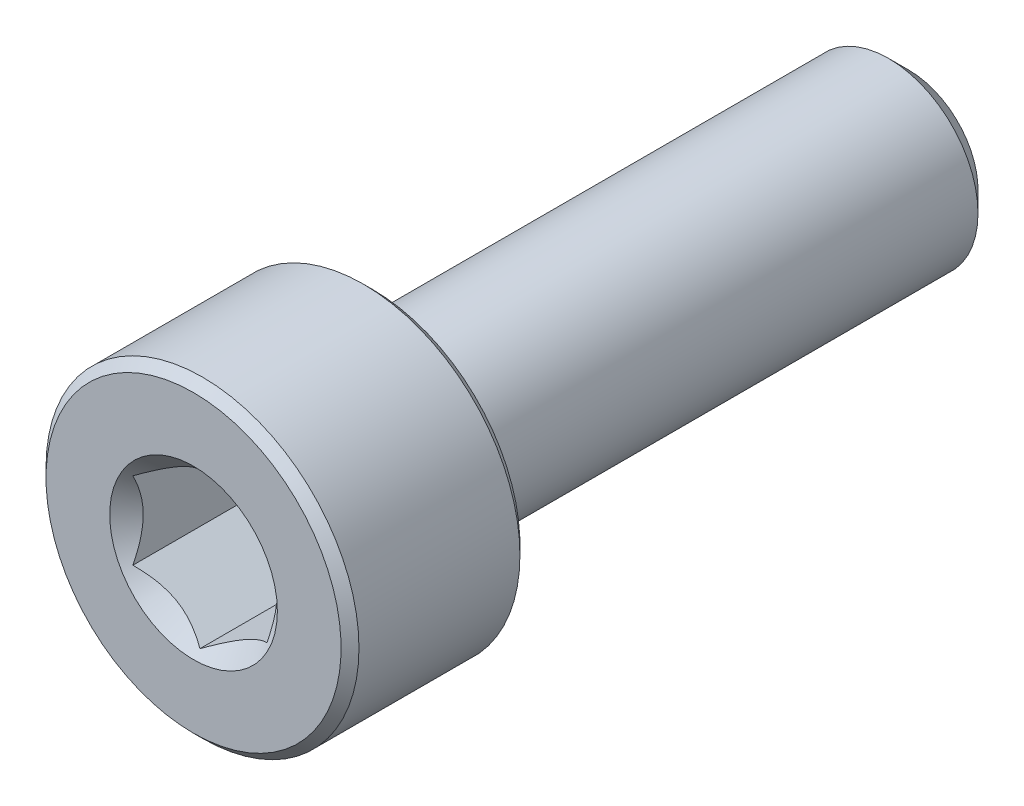
ISO-10303-21;
HEADER;
FILE_DESCRIPTION(('STEP AP214'),'2;1');
FILE_NAME('part.step','',(''),(''),'','','');
FILE_SCHEMA(('AUTOMOTIVE_DESIGN { 1 0 10303 214 1 1 1 1 }'));
ENDSEC;
DATA;
#1=APPLICATION_CONTEXT('core data for automotive mechanical design processes');
#2=APPLICATION_PROTOCOL_DEFINITION('international standard','automotive_design',2000,#1);
#3=PRODUCT_CONTEXT('',#1,'mechanical');
#4=PRODUCT('Part','Part','',(#3));
#5=PRODUCT_RELATED_PRODUCT_CATEGORY('part','',(#4));
#6=PRODUCT_DEFINITION_FORMATION('','',#4);
#7=PRODUCT_DEFINITION_CONTEXT('part definition',#1,'design');
#8=PRODUCT_DEFINITION('design','',#6,#7);
#9=PRODUCT_DEFINITION_SHAPE('','',#8);
#10=(LENGTH_UNIT() NAMED_UNIT(*) SI_UNIT(.MILLI.,.METRE.));
#11=(NAMED_UNIT(*) PLANE_ANGLE_UNIT() SI_UNIT($,.RADIAN.));
#12=(NAMED_UNIT(*) SI_UNIT($,.STERADIAN.) SOLID_ANGLE_UNIT());
#13=UNCERTAINTY_MEASURE_WITH_UNIT(LENGTH_MEASURE(1.E-05),#10,'distance_accuracy_value','');
#14=(GEOMETRIC_REPRESENTATION_CONTEXT(3) GLOBAL_UNCERTAINTY_ASSIGNED_CONTEXT((#13)) GLOBAL_UNIT_ASSIGNED_CONTEXT((#10,
#11,#12)) REPRESENTATION_CONTEXT('',''));
#15=CARTESIAN_POINT('',(0.,0.,0.));
#16=DIRECTION('',(0.,0.,1.));
#17=DIRECTION('',(1.,0.,0.));
#18=AXIS2_PLACEMENT_3D('',#15,#16,#17);
#19=CARTESIAN_POINT('',(0.,1.54533666301317,-8.));
#20=DIRECTION('',(0.,0.,-1.));
#21=DIRECTION('',(0.,1.,0.));
#22=AXIS2_PLACEMENT_3D('',#19,#20,#21);
#23=PLANE('',#22);
#24=CARTESIAN_POINT('',(0.,0.,-8.));
#25=DIRECTION('',(0.,0.,-1.));
#26=DIRECTION('',(0.,1.,0.));
#27=AXIS2_PLACEMENT_3D('',#24,#25,#26);
#28=CIRCLE('',#27,1.54533666301317);
#29=CARTESIAN_POINT('',(0.,1.54533666301317,-8.));
#30=VERTEX_POINT('',#29);
#31=EDGE_CURVE('E54',#30,#30,#28,.T.);
#32=ORIENTED_EDGE('',*,*,#31,.T.);
#33=EDGE_LOOP('',(#32));
#34=FACE_BOUND('',#33,.T.);
#35=ADVANCED_FACE('F41',(#34),#23,.T.);
#36=CARTESIAN_POINT('',(0.,0.,-8.));
#37=DIRECTION('',(0.,0.,1.));
#38=DIRECTION('',(0.,-1.,0.));
#39=AXIS2_PLACEMENT_3D('',#36,#37,#38);
#40=CONICAL_SURFACE('',#39,1.54533666301317,0.785398163397447);
#41=CARTESIAN_POINT('',(0.,0.,-7.54533666301317));
#42=DIRECTION('',(0.,0.,-1.));
#43=DIRECTION('',(0.,1.,0.));
#44=AXIS2_PLACEMENT_3D('',#41,#42,#43);
#45=CIRCLE('',#44,2.);
#46=CARTESIAN_POINT('',(0.,2.,-7.54533666301317));
#47=VERTEX_POINT('',#46);
#48=EDGE_CURVE('E157',#47,#47,#45,.T.);
#49=ORIENTED_EDGE('',*,*,#48,.T.);
#50=EDGE_LOOP('',(#49));
#51=FACE_BOUND('',#50,.T.);
#52=ORIENTED_EDGE('',*,*,#31,.F.);
#53=EDGE_LOOP('',(#52));
#54=FACE_BOUND('',#53,.T.);
#55=ADVANCED_FACE('F163',(#51,#54),#40,.T.);
#56=CARTESIAN_POINT('',(0.,0.,-8.));
#57=DIRECTION('',(0.,0.,-1.));
#58=DIRECTION('',(0.,1.,0.));
#59=AXIS2_PLACEMENT_3D('',#56,#57,#58);
#60=CYLINDRICAL_SURFACE('',#59,2.);
#61=CARTESIAN_POINT('',(0.,0.,3.8));
#62=DIRECTION('',(0.,0.,-1.));
#63=DIRECTION('',(0.,1.,0.));
#64=AXIS2_PLACEMENT_3D('',#61,#62,#63);
#65=CIRCLE('',#64,2.);
#66=CARTESIAN_POINT('',(0.,2.,3.8));
#67=VERTEX_POINT('',#66);
#68=EDGE_CURVE('E154',#67,#67,#65,.T.);
#69=ORIENTED_EDGE('',*,*,#68,.T.);
#70=EDGE_LOOP('',(#69));
#71=FACE_BOUND('',#70,.T.);
#72=ORIENTED_EDGE('',*,*,#48,.F.);
#73=EDGE_LOOP('',(#72));
#74=FACE_BOUND('',#73,.T.);
#75=ADVANCED_FACE('F165',(#71,#74),#60,.T.);
#76=CARTESIAN_POINT('',(0.,0.,3.8));
#77=DIRECTION('',(0.,0.,-1.));
#78=DIRECTION('',(0.,1.,0.));
#79=AXIS2_PLACEMENT_3D('',#76,#77,#78);
#80=TOROIDAL_SURFACE('',#79,2.2,0.200000000000001);
#81=CARTESIAN_POINT('',(0.,0.,4.));
#82=DIRECTION('',(0.,0.,-1.));
#83=DIRECTION('',(0.,1.,0.));
#84=AXIS2_PLACEMENT_3D('',#81,#82,#83);
#85=CIRCLE('',#84,2.2);
#86=CARTESIAN_POINT('',(0.,2.2,4.));
#87=VERTEX_POINT('',#86);
#88=EDGE_CURVE('E151',#87,#87,#85,.T.);
#89=ORIENTED_EDGE('',*,*,#88,.T.);
#90=EDGE_LOOP('',(#89));
#91=FACE_BOUND('',#90,.T.);
#92=ORIENTED_EDGE('',*,*,#68,.F.);
#93=EDGE_LOOP('',(#92));
#94=FACE_BOUND('',#93,.T.);
#95=ADVANCED_FACE('F171',(#91,#94),#80,.F.);
#96=CARTESIAN_POINT('',(0.,3.3,4.));
#97=DIRECTION('',(0.,0.,-1.));
#98=DIRECTION('',(0.,1.,0.));
#99=AXIS2_PLACEMENT_3D('',#96,#97,#98);
#100=PLANE('',#99);
#101=CARTESIAN_POINT('',(0.,0.,4.));
#102=DIRECTION('',(0.,0.,-1.));
#103=DIRECTION('',(0.,1.,0.));
#104=AXIS2_PLACEMENT_3D('',#101,#102,#103);
#105=CIRCLE('',#104,3.3);
#106=CARTESIAN_POINT('',(0.,3.3,4.));
#107=VERTEX_POINT('',#106);
#108=EDGE_CURVE('E148',#107,#107,#105,.T.);
#109=ORIENTED_EDGE('',*,*,#108,.T.);
#110=EDGE_LOOP('',(#109));
#111=FACE_BOUND('',#110,.T.);
#112=ORIENTED_EDGE('',*,*,#88,.F.);
#113=EDGE_LOOP('',(#112));
#114=FACE_BOUND('',#113,.T.);
#115=ADVANCED_FACE('F177',(#111,#114),#100,.T.);
#116=CARTESIAN_POINT('',(0.,0.,4.));
#117=DIRECTION('',(0.,0.,1.));
#118=DIRECTION('',(0.,-1.,0.));
#119=AXIS2_PLACEMENT_3D('',#116,#117,#118);
#120=CONICAL_SURFACE('',#119,3.3,0.785398163397452);
#121=CARTESIAN_POINT('',(0.,0.,4.2));
#122=DIRECTION('',(0.,0.,-1.));
#123=DIRECTION('',(0.,1.,0.));
#124=AXIS2_PLACEMENT_3D('',#121,#122,#123);
#125=CIRCLE('',#124,3.5);
#126=CARTESIAN_POINT('',(0.,3.5,4.2));
#127=VERTEX_POINT('',#126);
#128=EDGE_CURVE('E145',#127,#127,#125,.T.);
#129=ORIENTED_EDGE('',*,*,#128,.T.);
#130=EDGE_LOOP('',(#129));
#131=FACE_BOUND('',#130,.T.);
#132=ORIENTED_EDGE('',*,*,#108,.F.);
#133=EDGE_LOOP('',(#132));
#134=FACE_BOUND('',#133,.T.);
#135=ADVANCED_FACE('F181',(#131,#134),#120,.T.);
#136=CARTESIAN_POINT('',(0.,0.,-8.));
#137=DIRECTION('',(0.,0.,-1.));
#138=DIRECTION('',(0.,1.,0.));
#139=AXIS2_PLACEMENT_3D('',#136,#137,#138);
#140=CYLINDRICAL_SURFACE('',#139,3.5);
#141=CARTESIAN_POINT('',(0.,0.,7.8));
#142=DIRECTION('',(0.,0.,-1.));
#143=DIRECTION('',(0.,1.,0.));
#144=AXIS2_PLACEMENT_3D('',#141,#142,#143);
#145=CIRCLE('',#144,3.5);
#146=CARTESIAN_POINT('',(0.,3.5,7.8));
#147=VERTEX_POINT('',#146);
#148=EDGE_CURVE('E142',#147,#147,#145,.T.);
#149=ORIENTED_EDGE('',*,*,#148,.T.);
#150=EDGE_LOOP('',(#149));
#151=FACE_BOUND('',#150,.T.);
#152=ORIENTED_EDGE('',*,*,#128,.F.);
#153=EDGE_LOOP('',(#152));
#154=FACE_BOUND('',#153,.T.);
#155=ADVANCED_FACE('F185',(#151,#154),#140,.T.);
#156=CARTESIAN_POINT('',(0.,0.,7.8));
#157=DIRECTION('',(0.,0.,-1.));
#158=DIRECTION('',(0.,1.,0.));
#159=AXIS2_PLACEMENT_3D('',#156,#157,#158);
#160=CONICAL_SURFACE('',#159,3.5,0.785398163397452);
#161=CARTESIAN_POINT('',(0.,0.,8.));
#162=DIRECTION('',(0.,0.,-1.));
#163=DIRECTION('',(0.,1.,0.));
#164=AXIS2_PLACEMENT_3D('',#161,#162,#163);
#165=CIRCLE('',#164,3.3);
#166=CARTESIAN_POINT('',(0.,3.3,8.));
#167=VERTEX_POINT('',#166);
#168=EDGE_CURVE('E139',#167,#167,#165,.T.);
#169=ORIENTED_EDGE('',*,*,#168,.T.);
#170=EDGE_LOOP('',(#169));
#171=FACE_BOUND('',#170,.T.);
#172=ORIENTED_EDGE('',*,*,#148,.F.);
#173=EDGE_LOOP('',(#172));
#174=FACE_BOUND('',#173,.T.);
#175=ADVANCED_FACE('F189',(#171,#174),#160,.T.);
#176=CARTESIAN_POINT('',(0.,0.,8.));
#177=DIRECTION('',(0.,0.,1.));
#178=DIRECTION('',(0.,-1.,0.));
#179=AXIS2_PLACEMENT_3D('',#176,#177,#178);
#180=PLANE('',#179);
#181=CARTESIAN_POINT('',(0.,0.,8.));
#182=DIRECTION('',(0.,0.,1.));
#183=DIRECTION('',(1.,0.,0.));
#184=AXIS2_PLACEMENT_3D('',#181,#182,#183);
#185=CIRCLE('',#184,1.875);
#186=CARTESIAN_POINT('',(1.875,0.,8.));
#187=VERTEX_POINT('',#186);
#188=EDGE_CURVE('E113',#187,#187,#185,.T.);
#189=ORIENTED_EDGE('',*,*,#188,.F.);
#190=EDGE_LOOP('',(#189));
#191=FACE_BOUND('',#190,.T.);
#192=ORIENTED_EDGE('',*,*,#168,.F.);
#193=EDGE_LOOP('',(#192));
#194=FACE_BOUND('',#193,.T.);
#195=ADVANCED_FACE('F193',(#191,#194),#180,.T.);
#196=CARTESIAN_POINT('',(0.,0.,8.));
#197=DIRECTION('',(0.,0.,1.));
#198=DIRECTION('',(1.,0.,0.));
#199=AXIS2_PLACEMENT_3D('',#196,#197,#198);
#200=CONICAL_SURFACE('',#199,1.875,0.78539816339745);
#201=ORIENTED_EDGE('',*,*,#188,.T.);
#202=EDGE_LOOP('',(#201));
#203=FACE_BOUND('',#202,.T.);
#204=CARTESIAN_POINT('',(-0.000199999999999927,-1.73216627762272,7.85716628916895));
#205=CARTESIAN_POINT('',(0.0513677907370757,-1.70239359975915,7.8274162836362));
#206=CARTESIAN_POINT('',(0.103797917665201,-1.67212305186355,7.79941329147919));
#207=CARTESIAN_POINT('',(0.210709034055597,-1.61039789003619,7.74814003800902));
#208=CARTESIAN_POINT('',(0.265200195814661,-1.57893740312614,7.72489831261325));
#209=CARTESIAN_POINT('',(0.375079081357249,-1.51549879897987,7.6850845365611));
#210=CARTESIAN_POINT('',(0.4304388090952,-1.4835368452681,7.66841239323977));
#211=CARTESIAN_POINT('',(0.54237725747715,-1.41890915196211,7.64272526438698));
#212=CARTESIAN_POINT('',(0.598952556553008,-1.38624538781118,7.63369109804774));
#213=CARTESIAN_POINT('',(0.696455389516441,-1.32995210095299,7.62553988879573));
#214=CARTESIAN_POINT('',(0.737256908280466,-1.30639533311124,7.62433306055809));
#215=CARTESIAN_POINT('',(0.818787969615858,-1.25932335290193,7.62636486473115));
#216=CARTESIAN_POINT('',(0.85951749431463,-1.23580815085313,7.62960447831719));
#217=CARTESIAN_POINT('',(0.940584402163416,-1.18900414978427,7.64034279355084));
#218=CARTESIAN_POINT('',(0.980921384598288,-1.1657155821172,7.64784546058761));
#219=CARTESIAN_POINT('',(1.06091833691403,-1.11952932016335,7.66670241949717));
#220=CARTESIAN_POINT('',(1.10057800851621,-1.09663179808786,7.67805836458746));
#221=CARTESIAN_POINT('',(1.20216313477448,-1.03798159809698,7.71177245516155));
#222=CARTESIAN_POINT('',(1.26345855370969,-1.00259267147465,7.73667265666224));
#223=CARTESIAN_POINT('',(1.35358562846331,-0.950557780604375,7.77870746084045));
#224=CARTESIAN_POINT('',(1.38328513990772,-0.933410759677148,7.79347596112797));
#225=CARTESIAN_POINT('',(1.44213790138375,-0.899432101996407,7.82436137350905));
#226=CARTESIAN_POINT('',(1.47129140422064,-0.88260031928571,7.84047764169059));
#227=CARTESIAN_POINT('',(1.5002,-0.865909933730601,7.85716628916895));
#228=B_SPLINE_CURVE_WITH_KNOTS('',3,(#204,#205,#206,#207,#208,#209,#210,#211,#212,#213,#214,
#215,#216,#217,#218,#219,#220,#221,#222,#223,#224,#225,#226,#227),.UNSPECIFIED.,.F.,.F.,(4,2,2,
2,2,2,2,2,2,2,2,4),(0.,0.199829143693305,0.400822987382388,0.59862372053818,0.795926240188889,
0.937113067959881,1.07833105577193,1.21968061668222,1.36109089931054,1.58570969637565,
1.69770705470964,1.80965120737194),.UNSPECIFIED.);
#229=CARTESIAN_POINT('',(0.,-1.73205080756888,7.85705080756888));
#230=VERTEX_POINT('',#229);
#231=CARTESIAN_POINT('',(1.5,-0.866025403784439,7.85705080756888));
#232=VERTEX_POINT('',#231);
#233=EDGE_CURVE('E12',#230,#232,#228,.T.);
#234=ORIENTED_EDGE('',*,*,#233,.F.);
#235=CARTESIAN_POINT('',(-1.5002,-0.865909933730601,7.85716628916895));
#236=CARTESIAN_POINT('',(-1.44863220926292,-0.895682611594166,7.82741628363621));
#237=CARTESIAN_POINT('',(-1.3962020823348,-0.925953159489765,7.79941329147919));
#238=CARTESIAN_POINT('',(-1.2892909659444,-0.987678321317124,7.74814003800902));
#239=CARTESIAN_POINT('',(-1.23479980418534,-1.01913880822717,7.72489831261325));
#240=CARTESIAN_POINT('',(-1.12492091864275,-1.08257741237344,7.6850845365611));
#241=CARTESIAN_POINT('',(-1.0695611909048,-1.11453936608521,7.66841239323977));
#242=CARTESIAN_POINT('',(-0.957622742522849,-1.1791670593912,7.64272526438698));
#243=CARTESIAN_POINT('',(-0.901047443446991,-1.21183082354213,7.63369109804774));
#244=CARTESIAN_POINT('',(-0.803544610483559,-1.26812411040032,7.62553988879573));
#245=CARTESIAN_POINT('',(-0.762743091719533,-1.29168087824208,7.62433306055809));
#246=CARTESIAN_POINT('',(-0.681212030384142,-1.33875285845138,7.62636486473115));
#247=CARTESIAN_POINT('',(-0.64048250568537,-1.36226806050018,7.62960447831719));
#248=CARTESIAN_POINT('',(-0.559415597836584,-1.40907206156905,7.64034279355084));
#249=CARTESIAN_POINT('',(-0.519078615401712,-1.43236062923612,7.64784546058761));
#250=CARTESIAN_POINT('',(-0.439081663085969,-1.47854689118996,7.66670241949717));
#251=CARTESIAN_POINT('',(-0.399421991483792,-1.50144441326545,7.67805836458746));
#252=CARTESIAN_POINT('',(-0.297836865225515,-1.56009461325633,7.71177245516155));
#253=CARTESIAN_POINT('',(-0.236541446290311,-1.59548353987866,7.73667265666225));
#254=CARTESIAN_POINT('',(-0.146414371536687,-1.64751843074894,7.77870746084045));
#255=CARTESIAN_POINT('',(-0.116714860092282,-1.66466545167617,7.79347596112797));
#256=CARTESIAN_POINT('',(-0.0578620986162491,-1.69864410935691,7.82436137350905));
#257=CARTESIAN_POINT('',(-0.0287085957793629,-1.71547589206761,7.84047764169059));
#258=CARTESIAN_POINT('',(0.000199999999999761,-1.73216627762272,7.85716628916895));
#259=B_SPLINE_CURVE_WITH_KNOTS('',3,(#235,#236,#237,#238,#239,#240,#241,#242,#243,#244,#245,
#246,#247,#248,#249,#250,#251,#252,#253,#254,#255,#256,#257,#258),.UNSPECIFIED.,.F.,.F.,(4,2,2,
2,2,2,2,2,2,2,2,4),(0.,0.199829143693305,0.400822987382389,0.598623720538181,0.795926240188889,
0.937113067959881,1.07833105577193,1.21968061668222,1.36109089931054,1.58570969637565,
1.69770705470964,1.80965120737194),.UNSPECIFIED.);
#260=CARTESIAN_POINT('',(-1.5,-0.866025403784439,7.85705080756888));
#261=VERTEX_POINT('',#260);
#262=EDGE_CURVE('E99',#261,#230,#259,.T.);
#263=ORIENTED_EDGE('',*,*,#262,.F.);
#264=CARTESIAN_POINT('',(-1.5,-1.82724616303013,8.4890703331983));
#265=CARTESIAN_POINT('',(-1.5,-1.78317586660663,8.45501239995677));
#266=CARTESIAN_POINT('',(-1.5,-1.73887128511932,8.4212586157948));
#267=CARTESIAN_POINT('',(-1.5,-1.64969483826883,8.35448777226094));
#268=CARTESIAN_POINT('',(-1.5,-1.60482284303166,8.32147088651893));
#269=CARTESIAN_POINT('',(-1.5,-1.46855205058729,8.22324713276));
#270=CARTESIAN_POINT('',(-1.5,-1.37616527732981,8.15938887980909));
#271=CARTESIAN_POINT('',(-1.5,-1.18175814530896,8.03306555241423));
#272=CARTESIAN_POINT('',(-1.5,-1.07950173722928,7.97096001610314));
#273=CARTESIAN_POINT('',(-1.5,-0.86976203091701,7.85669692365493));
#274=CARTESIAN_POINT('',(-1.5,-0.762297993140727,7.8045057692236));
#275=CARTESIAN_POINT('',(-1.5,-0.601919355462973,7.74062745548581));
#276=CARTESIAN_POINT('',(-1.5,-0.551595099321827,7.72247344848169));
#277=CARTESIAN_POINT('',(-1.5,-0.449644044337813,7.69019628138117));
#278=CARTESIAN_POINT('',(-1.5,-0.398017164202741,7.67607337353211));
#279=CARTESIAN_POINT('',(-1.5,-0.294682921970128,7.65286025130534));
#280=CARTESIAN_POINT('',(-1.5,-0.242996732973226,7.64367732834991));
#281=CARTESIAN_POINT('',(-1.5,-0.138960185913601,7.63054010534325));
#282=CARTESIAN_POINT('',(-1.5,-0.0866099744986999,7.62658467043386));
#283=CARTESIAN_POINT('',(-1.5,0.0158213358469602,7.62424944439602));
#284=CARTESIAN_POINT('',(-1.5,0.0658968533581894,7.62562321720099));
#285=CARTESIAN_POINT('',(-1.5,0.165665754885723,7.63330038456717));
#286=CARTESIAN_POINT('',(-1.5,0.215359104450809,7.63960421841715));
#287=CARTESIAN_POINT('',(-1.5,0.314848006923592,7.65688863172927));
#288=CARTESIAN_POINT('',(-1.5,0.364628847818078,7.66795253034827));
#289=CARTESIAN_POINT('',(-1.5,0.463087713283466,7.69413916239748));
#290=CARTESIAN_POINT('',(-1.5,0.511765792737121,7.7092616933524));
#291=CARTESIAN_POINT('',(-1.5,0.660788843897246,7.76136082058242));
#292=CARTESIAN_POINT('',(-1.5,0.759116657247093,7.80408886600696));
#293=CARTESIAN_POINT('',(-1.5,0.95118448246347,7.8991892536357));
#294=CARTESIAN_POINT('',(-1.5,1.04490689498041,7.95159542441679));
#295=CARTESIAN_POINT('',(-1.5,1.22407036992814,8.05981955502163));
#296=CARTESIAN_POINT('',(-1.5,1.30969196520695,8.11534242328386));
#297=CARTESIAN_POINT('',(-1.5,1.43583732283972,8.20122204414168));
#298=CARTESIAN_POINT('',(-1.5,1.47734359009407,8.23016065506323));
#299=CARTESIAN_POINT('',(-1.5,1.5597863256648,8.28881558305804));
#300=CARTESIAN_POINT('',(-1.5,1.60072294793761,8.31853168349227));
#301=CARTESIAN_POINT('',(-1.5,1.64142194027434,8.34857054891766));
#302=B_SPLINE_CURVE_WITH_KNOTS('',3,(#264,#265,#266,#267,#268,#269,#270,#271,#272,#273,#274,
#275,#276,#277,#278,#279,#280,#281,#282,#283,#284,#285,#286,#287,#288,#289,#290,#291,#292,#293,
#294,#295,#296,#297,#298,#299,#300,#301),.UNSPECIFIED.,.F.,.F.,(4,2,2,2,2,2,2,2,2,2,2,2,2,2,2,2,
2,2,4),(0.,0.167086436601659,0.334211835551279,0.671001298251585,1.02965358816391,
1.38706788816987,1.54743005800718,1.70780226036013,1.86504930542636,2.02226220743606,
2.17229379545786,2.3223387534361,2.47512433054573,2.62790228697088,2.94859878977715,
3.27043822191845,3.57642907004227,3.72821874189076,3.87996656039159),.UNSPECIFIED.);
#303=CARTESIAN_POINT('',(-1.5,0.866025403784438,7.85705080756888));
#304=VERTEX_POINT('',#303);
#305=EDGE_CURVE('E112',#304,#261,#302,.F.);
#306=ORIENTED_EDGE('',*,*,#305,.F.);
#307=CARTESIAN_POINT('',(0.000199999999999728,1.73216627762271,7.85716628916895));
#308=CARTESIAN_POINT('',(-0.051367790737076,1.70239359975915,7.82741628363621));
#309=CARTESIAN_POINT('',(-0.103797917665201,1.67212305186355,7.79941329147919));
#310=CARTESIAN_POINT('',(-0.210709034055597,1.61039789003619,7.74814003800902));
#311=CARTESIAN_POINT('',(-0.265200195814661,1.57893740312614,7.72489831261325));
#312=CARTESIAN_POINT('',(-0.375079081357249,1.51549879897987,7.6850845365611));
#313=CARTESIAN_POINT('',(-0.4304388090952,1.4835368452681,7.66841239323977));
#314=CARTESIAN_POINT('',(-0.542377257477151,1.41890915196211,7.64272526438698));
#315=CARTESIAN_POINT('',(-0.598952556553009,1.38624538781118,7.63369109804774));
#316=CARTESIAN_POINT('',(-0.696455389516442,1.32995210095299,7.62553988879573));
#317=CARTESIAN_POINT('',(-0.737256908280467,1.30639533311124,7.62433306055809));
#318=CARTESIAN_POINT('',(-0.818787969615859,1.25932335290193,7.62636486473115));
#319=CARTESIAN_POINT('',(-0.859517494314631,1.23580815085313,7.62960447831719));
#320=CARTESIAN_POINT('',(-0.940584402163417,1.18900414978427,7.64034279355084));
#321=CARTESIAN_POINT('',(-0.980921384598289,1.16571558211719,7.64784546058761));
#322=CARTESIAN_POINT('',(-1.06091833691403,1.11952932016335,7.66670241949717));
#323=CARTESIAN_POINT('',(-1.10057800851621,1.09663179808786,7.67805836458746));
#324=CARTESIAN_POINT('',(-1.20216313477449,1.03798159809698,7.71177245516155));
#325=CARTESIAN_POINT('',(-1.26345855370969,1.00259267147465,7.73667265666224));
#326=CARTESIAN_POINT('',(-1.35358562846331,0.950557780604374,7.77870746084045));
#327=CARTESIAN_POINT('',(-1.38328513990772,0.933410759677147,7.79347596112797));
#328=CARTESIAN_POINT('',(-1.44213790138375,0.899432101996406,7.82436137350905));
#329=CARTESIAN_POINT('',(-1.47129140422064,0.88260031928571,7.84047764169059));
#330=CARTESIAN_POINT('',(-1.5002,0.865909933730601,7.85716628916895));
#331=B_SPLINE_CURVE_WITH_KNOTS('',3,(#307,#308,#309,#310,#311,#312,#313,#314,#315,#316,#317,
#318,#319,#320,#321,#322,#323,#324,#325,#326,#327,#328,#329,#330),.UNSPECIFIED.,.F.,.F.,(4,2,2,
2,2,2,2,2,2,2,2,4),(0.,0.199829143693305,0.400822987382389,0.598623720538182,0.79592624018889,
0.937113067959882,1.07833105577193,1.21968061668222,1.36109089931055,1.58570969637565,
1.69770705470964,1.80965120737194),.UNSPECIFIED.);
#332=CARTESIAN_POINT('',(0.,1.73205080756888,7.85705080756888));
#333=VERTEX_POINT('',#332);
#334=EDGE_CURVE('E243',#333,#304,#331,.T.);
#335=ORIENTED_EDGE('',*,*,#334,.F.);
#336=CARTESIAN_POINT('',(1.5002,0.865909933730601,7.85716628916895));
#337=CARTESIAN_POINT('',(1.44863220926292,0.895682611594166,7.82741628363621));
#338=CARTESIAN_POINT('',(1.3962020823348,0.925953159489765,7.79941329147919));
#339=CARTESIAN_POINT('',(1.2892909659444,0.987678321317123,7.74814003800902));
#340=CARTESIAN_POINT('',(1.23479980418534,1.01913880822717,7.72489831261325));
#341=CARTESIAN_POINT('',(1.12492091864275,1.08257741237344,7.6850845365611));
#342=CARTESIAN_POINT('',(1.0695611909048,1.11453936608521,7.66841239323977));
#343=CARTESIAN_POINT('',(0.957622742522849,1.1791670593912,7.64272526438698));
#344=CARTESIAN_POINT('',(0.901047443446991,1.21183082354213,7.63369109804774));
#345=CARTESIAN_POINT('',(0.803544610483559,1.26812411040032,7.62553988879573));
#346=CARTESIAN_POINT('',(0.762743091719533,1.29168087824208,7.62433306055809));
#347=CARTESIAN_POINT('',(0.681212030384141,1.33875285845138,7.62636486473115));
#348=CARTESIAN_POINT('',(0.64048250568537,1.36226806050018,7.62960447831718));
#349=CARTESIAN_POINT('',(0.559415597836584,1.40907206156905,7.64034279355084));
#350=CARTESIAN_POINT('',(0.519078615401712,1.43236062923612,7.64784546058761));
#351=CARTESIAN_POINT('',(0.439081663085969,1.47854689118996,7.66670241949717));
#352=CARTESIAN_POINT('',(0.399421991483792,1.50144441326545,7.67805836458746));
#353=CARTESIAN_POINT('',(0.297836865225515,1.56009461325633,7.71177245516155));
#354=CARTESIAN_POINT('',(0.236541446290311,1.59548353987866,7.73667265666224));
#355=CARTESIAN_POINT('',(0.146414371536687,1.64751843074894,7.77870746084045));
#356=CARTESIAN_POINT('',(0.116714860092283,1.66466545167617,7.79347596112797));
#357=CARTESIAN_POINT('',(0.0578620986162495,1.69864410935691,7.82436137350905));
#358=CARTESIAN_POINT('',(0.0287085957793629,1.71547589206761,7.84047764169059));
#359=CARTESIAN_POINT('',(-0.000200000000000218,1.73216627762271,7.85716628916895));
#360=B_SPLINE_CURVE_WITH_KNOTS('',3,(#336,#337,#338,#339,#340,#341,#342,#343,#344,#345,#346,
#347,#348,#349,#350,#351,#352,#353,#354,#355,#356,#357,#358,#359),.UNSPECIFIED.,.F.,.F.,(4,2,2,
2,2,2,2,2,2,2,2,4),(0.,0.199829143693305,0.400822987382389,0.598623720538181,0.79592624018889,
0.937113067959882,1.07833105577193,1.21968061668222,1.36109089931054,1.58570969637565,
1.69770705470964,1.80965120737194),.UNSPECIFIED.);
#361=CARTESIAN_POINT('',(1.5,0.866025403784439,7.85705080756888));
#362=VERTEX_POINT('',#361);
#363=EDGE_CURVE('E216',#362,#333,#360,.T.);
#364=ORIENTED_EDGE('',*,*,#363,.F.);
#365=CARTESIAN_POINT('',(1.5,-1.82724616303013,8.4890703331983));
#366=CARTESIAN_POINT('',(1.5,-1.78317586660663,8.45501239995677));
#367=CARTESIAN_POINT('',(1.5,-1.73887128511932,8.4212586157948));
#368=CARTESIAN_POINT('',(1.5,-1.64969483826883,8.35448777226094));
#369=CARTESIAN_POINT('',(1.5,-1.60482284303166,8.32147088651893));
#370=CARTESIAN_POINT('',(1.5,-1.46855205058729,8.22324713276));
#371=CARTESIAN_POINT('',(1.5,-1.37616527732981,8.15938887980909));
#372=CARTESIAN_POINT('',(1.5,-1.18175814530896,8.03306555241423));
#373=CARTESIAN_POINT('',(1.5,-1.07950173722928,7.97096001610314));
#374=CARTESIAN_POINT('',(1.5,-0.86976203091701,7.85669692365493));
#375=CARTESIAN_POINT('',(1.5,-0.762297993140726,7.8045057692236));
#376=CARTESIAN_POINT('',(1.5,-0.601919355462973,7.74062745548581));
#377=CARTESIAN_POINT('',(1.5,-0.551595099321827,7.72247344848169));
#378=CARTESIAN_POINT('',(1.5,-0.449644044337812,7.69019628138117));
#379=CARTESIAN_POINT('',(1.5,-0.398017164202741,7.67607337353211));
#380=CARTESIAN_POINT('',(1.5,-0.294682921970128,7.65286025130534));
#381=CARTESIAN_POINT('',(1.5,-0.242996732973227,7.64367732834991));
#382=CARTESIAN_POINT('',(1.5,-0.138960185913602,7.63054010534325));
#383=CARTESIAN_POINT('',(1.5,-0.086609974498701,7.62658467043386));
#384=CARTESIAN_POINT('',(1.5,0.0158213358469591,7.62424944439602));
#385=CARTESIAN_POINT('',(1.5,0.0658968533581883,7.62562321720099));
#386=CARTESIAN_POINT('',(1.5,0.165665754885721,7.63330038456716));
#387=CARTESIAN_POINT('',(1.5,0.215359104450808,7.63960421841715));
#388=CARTESIAN_POINT('',(1.5,0.314848006923591,7.65688863172927));
#389=CARTESIAN_POINT('',(1.5,0.364628847818077,7.66795253034827));
#390=CARTESIAN_POINT('',(1.5,0.463087713283465,7.69413916239748));
#391=CARTESIAN_POINT('',(1.5,0.511765792737121,7.7092616933524));
#392=CARTESIAN_POINT('',(1.5,0.660788843897245,7.76136082058242));
#393=CARTESIAN_POINT('',(1.5,0.759116657247092,7.80408886600696));
#394=CARTESIAN_POINT('',(1.5,0.951184482463468,7.8991892536357));
#395=CARTESIAN_POINT('',(1.5,1.04490689498041,7.95159542441679));
#396=CARTESIAN_POINT('',(1.5,1.22407036992813,8.05981955502163));
#397=CARTESIAN_POINT('',(1.5,1.30969196520694,8.11534242328386));
#398=CARTESIAN_POINT('',(1.5,1.43583732283972,8.20122204414168));
#399=CARTESIAN_POINT('',(1.5,1.47734359009407,8.23016065506323));
#400=CARTESIAN_POINT('',(1.5,1.55978632566479,8.28881558305804));
#401=CARTESIAN_POINT('',(1.5,1.60072294793761,8.31853168349227));
#402=CARTESIAN_POINT('',(1.5,1.64142194027434,8.34857054891766));
#403=B_SPLINE_CURVE_WITH_KNOTS('',3,(#365,#366,#367,#368,#369,#370,#371,#372,#373,#374,#375,
#376,#377,#378,#379,#380,#381,#382,#383,#384,#385,#386,#387,#388,#389,#390,#391,#392,#393,#394,
#395,#396,#397,#398,#399,#400,#401,#402),.UNSPECIFIED.,.F.,.F.,(4,2,2,2,2,2,2,2,2,2,2,2,2,2,2,2,
2,2,4),(0.,0.167086436601659,0.334211835551279,0.671001298251586,1.02965358816391,
1.38706788816987,1.54743005800718,1.70780226036013,1.86504930542636,2.02226220743606,
2.17229379545786,2.3223387534361,2.47512433054572,2.62790228697088,2.94859878977715,
3.27043822191844,3.57642907004227,3.72821874189075,3.87996656039158),.UNSPECIFIED.);
#404=EDGE_CURVE('E61',#232,#362,#403,.T.);
#405=ORIENTED_EDGE('',*,*,#404,.F.);
#406=EDGE_LOOP('',(#234,#263,#306,#335,#364,#405));
#407=FACE_BOUND('',#406,.T.);
#408=ADVANCED_FACE('F98',(#203,#407),#200,.F.);
#409=CARTESIAN_POINT('',(0.,3.3,5.));
#410=DIRECTION('',(0.,0.,-1.));
#411=DIRECTION('',(0.,1.,0.));
#412=AXIS2_PLACEMENT_3D('',#409,#410,#411);
#413=PLANE('',#412);
#414=DIRECTION('',(0.866025403784439,0.5,0.));
#415=VECTOR('',#414,1.);
#416=CARTESIAN_POINT('',(0.,-1.73205080756888,5.));
#417=LINE('',#416,#415);
#418=CARTESIAN_POINT('',(0.,-1.73205080756888,5.));
#419=VERTEX_POINT('',#418);
#420=CARTESIAN_POINT('',(1.5,-0.866025403784439,5.));
#421=VERTEX_POINT('',#420);
#422=EDGE_CURVE('E116',#419,#421,#417,.T.);
#423=ORIENTED_EDGE('',*,*,#422,.T.);
#424=DIRECTION('',(0.,1.,0.));
#425=VECTOR('',#424,1.);
#426=CARTESIAN_POINT('',(1.5,-0.866025403784439,5.));
#427=LINE('',#426,#425);
#428=CARTESIAN_POINT('',(1.5,0.866025403784438,5.));
#429=VERTEX_POINT('',#428);
#430=EDGE_CURVE('E68',#421,#429,#427,.T.);
#431=ORIENTED_EDGE('',*,*,#430,.T.);
#432=DIRECTION('',(-0.866025403784439,0.5,0.));
#433=VECTOR('',#432,1.);
#434=CARTESIAN_POINT('',(1.5,0.866025403784438,5.));
#435=LINE('',#434,#433);
#436=CARTESIAN_POINT('',(0.,1.73205080756888,5.));
#437=VERTEX_POINT('',#436);
#438=EDGE_CURVE('E124',#429,#437,#435,.T.);
#439=ORIENTED_EDGE('',*,*,#438,.T.);
#440=DIRECTION('',(-0.866025403784439,-0.5,0.));
#441=VECTOR('',#440,1.);
#442=CARTESIAN_POINT('',(0.,1.73205080756888,5.));
#443=LINE('',#442,#441);
#444=CARTESIAN_POINT('',(-1.5,0.866025403784439,5.));
#445=VERTEX_POINT('',#444);
#446=EDGE_CURVE('E131',#437,#445,#443,.T.);
#447=ORIENTED_EDGE('',*,*,#446,.T.);
#448=DIRECTION('',(0.,-1.,0.));
#449=VECTOR('',#448,1.);
#450=CARTESIAN_POINT('',(-1.5,0.866025403784438,5.));
#451=LINE('',#450,#449);
#452=CARTESIAN_POINT('',(-1.5,-0.866025403784439,5.));
#453=VERTEX_POINT('',#452);
#454=EDGE_CURVE('E127',#445,#453,#451,.T.);
#455=ORIENTED_EDGE('',*,*,#454,.T.);
#456=DIRECTION('',(0.866025403784439,-0.5,0.));
#457=VECTOR('',#456,1.);
#458=CARTESIAN_POINT('',(-1.5,-0.866025403784439,5.));
#459=LINE('',#458,#457);
#460=EDGE_CURVE('E117',#453,#419,#459,.T.);
#461=ORIENTED_EDGE('',*,*,#460,.T.);
#462=EDGE_LOOP('',(#423,#431,#439,#447,#455,#461));
#463=FACE_BOUND('',#462,.T.);
#464=ADVANCED_FACE('F198',(#463),#413,.F.);
#465=CARTESIAN_POINT('',(0.,-1.73205080756888,-0.582575694955839));
#466=DIRECTION('',(0.5,-0.866025403784439,0.));
#467=DIRECTION('',(0.866025403784439,0.5,0.));
#468=AXIS2_PLACEMENT_3D('',#465,#466,#467);
#469=PLANE('',#468);
#470=DIRECTION('',(0.,0.,1.));
#471=VECTOR('',#470,1.);
#472=CARTESIAN_POINT('',(0.,-1.73205080756888,-0.582575694955839));
#473=LINE('',#472,#471);
#474=EDGE_CURVE('E108',#419,#230,#473,.T.);
#475=ORIENTED_EDGE('',*,*,#474,.T.);
#476=ORIENTED_EDGE('',*,*,#233,.T.);
#477=DIRECTION('',(0.,0.,1.));
#478=VECTOR('',#477,1.);
#479=CARTESIAN_POINT('',(1.5,-0.866025403784439,-0.582575694955839));
#480=LINE('',#479,#478);
#481=EDGE_CURVE('E119',#421,#232,#480,.T.);
#482=ORIENTED_EDGE('',*,*,#481,.F.);
#483=ORIENTED_EDGE('',*,*,#422,.F.);
#484=EDGE_LOOP('',(#475,#476,#482,#483));
#485=FACE_BOUND('',#484,.T.);
#486=ADVANCED_FACE('F115',(#485),#469,.F.);
#487=CARTESIAN_POINT('',(-1.5,-0.866025403784439,-0.582575694955839));
#488=DIRECTION('',(-0.5,-0.866025403784439,0.));
#489=DIRECTION('',(0.866025403784439,-0.5,0.));
#490=AXIS2_PLACEMENT_3D('',#487,#488,#489);
#491=PLANE('',#490);
#492=DIRECTION('',(0.,0.,1.));
#493=VECTOR('',#492,1.);
#494=CARTESIAN_POINT('',(-1.5,-0.866025403784439,-0.582575694955839));
#495=LINE('',#494,#493);
#496=EDGE_CURVE('E111',#453,#261,#495,.T.);
#497=ORIENTED_EDGE('',*,*,#496,.T.);
#498=ORIENTED_EDGE('',*,*,#262,.T.);
#499=ORIENTED_EDGE('',*,*,#474,.F.);
#500=ORIENTED_EDGE('',*,*,#460,.F.);
#501=EDGE_LOOP('',(#497,#498,#499,#500));
#502=FACE_BOUND('',#501,.T.);
#503=ADVANCED_FACE('F107',(#502),#491,.F.);
#504=CARTESIAN_POINT('',(-1.5,0.866025403784438,-0.582575694955839));
#505=DIRECTION('',(-1.,0.,0.));
#506=DIRECTION('',(0.,0.,1.));
#507=AXIS2_PLACEMENT_3D('',#504,#505,#506);
#508=PLANE('',#507);
#509=DIRECTION('',(0.,0.,1.));
#510=VECTOR('',#509,1.);
#511=CARTESIAN_POINT('',(-1.5,0.866025403784438,-0.582575694955839));
#512=LINE('',#511,#510);
#513=EDGE_CURVE('E128',#445,#304,#512,.T.);
#514=ORIENTED_EDGE('',*,*,#513,.T.);
#515=ORIENTED_EDGE('',*,*,#305,.T.);
#516=ORIENTED_EDGE('',*,*,#496,.F.);
#517=ORIENTED_EDGE('',*,*,#454,.F.);
#518=EDGE_LOOP('',(#514,#515,#516,#517));
#519=FACE_BOUND('',#518,.T.);
#520=ADVANCED_FACE('F252',(#519),#508,.F.);
#521=CARTESIAN_POINT('',(0.,1.73205080756888,-0.582575694955839));
#522=DIRECTION('',(-0.5,0.866025403784439,0.));
#523=DIRECTION('',(-0.866025403784439,-0.5,0.));
#524=AXIS2_PLACEMENT_3D('',#521,#522,#523);
#525=PLANE('',#524);
#526=DIRECTION('',(0.,0.,1.));
#527=VECTOR('',#526,1.);
#528=CARTESIAN_POINT('',(0.,1.73205080756888,-0.582575694955839));
#529=LINE('',#528,#527);
#530=EDGE_CURVE('E132',#437,#333,#529,.T.);
#531=ORIENTED_EDGE('',*,*,#530,.T.);
#532=ORIENTED_EDGE('',*,*,#334,.T.);
#533=ORIENTED_EDGE('',*,*,#513,.F.);
#534=ORIENTED_EDGE('',*,*,#446,.F.);
#535=EDGE_LOOP('',(#531,#532,#533,#534));
#536=FACE_BOUND('',#535,.T.);
#537=ADVANCED_FACE('F249',(#536),#525,.F.);
#538=CARTESIAN_POINT('',(1.5,0.866025403784438,-0.582575694955839));
#539=DIRECTION('',(0.5,0.866025403784439,0.));
#540=DIRECTION('',(-0.866025403784439,0.5,0.));
#541=AXIS2_PLACEMENT_3D('',#538,#539,#540);
#542=PLANE('',#541);
#543=DIRECTION('',(0.,0.,1.));
#544=VECTOR('',#543,1.);
#545=CARTESIAN_POINT('',(1.5,0.866025403784438,-0.582575694955839));
#546=LINE('',#545,#544);
#547=EDGE_CURVE('E135',#429,#362,#546,.T.);
#548=ORIENTED_EDGE('',*,*,#547,.T.);
#549=ORIENTED_EDGE('',*,*,#363,.T.);
#550=ORIENTED_EDGE('',*,*,#530,.F.);
#551=ORIENTED_EDGE('',*,*,#438,.F.);
#552=EDGE_LOOP('',(#548,#549,#550,#551));
#553=FACE_BOUND('',#552,.T.);
#554=ADVANCED_FACE('F206',(#553),#542,.F.);
#555=CARTESIAN_POINT('',(1.5,-0.866025403784439,-0.582575694955839));
#556=DIRECTION('',(1.,0.,0.));
#557=DIRECTION('',(0.,0.,-1.));
#558=AXIS2_PLACEMENT_3D('',#555,#556,#557);
#559=PLANE('',#558);
#560=ORIENTED_EDGE('',*,*,#481,.T.);
#561=ORIENTED_EDGE('',*,*,#404,.T.);
#562=ORIENTED_EDGE('',*,*,#547,.F.);
#563=ORIENTED_EDGE('',*,*,#430,.F.);
#564=EDGE_LOOP('',(#560,#561,#562,#563));
#565=FACE_BOUND('',#564,.T.);
#566=ADVANCED_FACE('F202',(#565),#559,.F.);
#567=CLOSED_SHELL('',(#35,#55,#75,#95,#115,#135,#155,#175,#195,#408,#464,#486,#503,#520,#537,
#554,#566));
#568=MANIFOLD_SOLID_BREP('B2',#567);
#569=ADVANCED_BREP_SHAPE_REPRESENTATION('',(#18,#568),#14);
#570=SHAPE_DEFINITION_REPRESENTATION(#9,#569);
ENDSEC;
END-ISO-10303-21;
